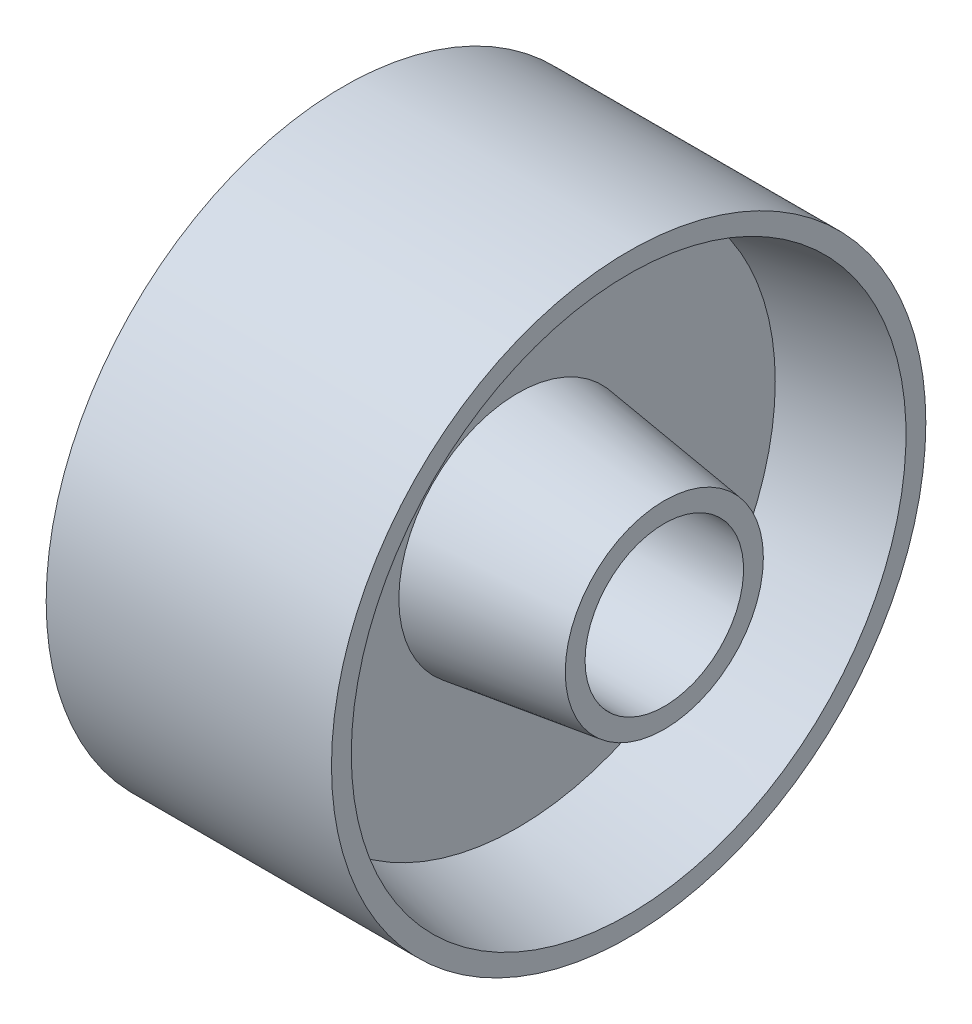
ISO-10303-21;
HEADER;
FILE_DESCRIPTION(('STEP AP214'),'2;1');
FILE_NAME('part.step','',(''),(''),'','','');
FILE_SCHEMA(('AUTOMOTIVE_DESIGN { 1 0 10303 214 1 1 1 1 }'));
ENDSEC;
DATA;
#1=APPLICATION_CONTEXT('core data for automotive mechanical design processes');
#2=APPLICATION_PROTOCOL_DEFINITION('international standard','automotive_design',2000,#1);
#3=PRODUCT_CONTEXT('',#1,'mechanical');
#4=PRODUCT('Part','Part','',(#3));
#5=PRODUCT_RELATED_PRODUCT_CATEGORY('part','',(#4));
#6=PRODUCT_DEFINITION_FORMATION('','',#4);
#7=PRODUCT_DEFINITION_CONTEXT('part definition',#1,'design');
#8=PRODUCT_DEFINITION('design','',#6,#7);
#9=PRODUCT_DEFINITION_SHAPE('','',#8);
#10=(LENGTH_UNIT() NAMED_UNIT(*) SI_UNIT(.MILLI.,.METRE.));
#11=(NAMED_UNIT(*) PLANE_ANGLE_UNIT() SI_UNIT($,.RADIAN.));
#12=(NAMED_UNIT(*) SI_UNIT($,.STERADIAN.) SOLID_ANGLE_UNIT());
#13=UNCERTAINTY_MEASURE_WITH_UNIT(LENGTH_MEASURE(1.E-05),#10,'distance_accuracy_value','');
#14=(GEOMETRIC_REPRESENTATION_CONTEXT(3) GLOBAL_UNCERTAINTY_ASSIGNED_CONTEXT((#13)) GLOBAL_UNIT_ASSIGNED_CONTEXT((#10,
#11,#12)) REPRESENTATION_CONTEXT('',''));
#15=CARTESIAN_POINT('',(0.,0.,0.));
#16=DIRECTION('',(0.,0.,1.));
#17=DIRECTION('',(1.,0.,0.));
#18=AXIS2_PLACEMENT_3D('',#15,#16,#17);
#19=CARTESIAN_POINT('',(36.,75.,0.));
#20=DIRECTION('',(-1.,0.,0.));
#21=DIRECTION('',(0.,0.,1.));
#22=AXIS2_PLACEMENT_3D('',#19,#20,#21);
#23=PLANE('',#22);
#24=CARTESIAN_POINT('',(36.,0.,0.));
#25=DIRECTION('',(-1.,0.,0.));
#26=DIRECTION('',(0.,0.,1.));
#27=AXIS2_PLACEMENT_3D('',#24,#25,#26);
#28=CIRCLE('',#27,75.);
#29=CARTESIAN_POINT('',(36.,0.,75.));
#30=VERTEX_POINT('',#29);
#31=EDGE_CURVE('E79',#30,#30,#28,.T.);
#32=ORIENTED_EDGE('',*,*,#31,.F.);
#33=EDGE_LOOP('',(#32));
#34=FACE_BOUND('',#33,.T.);
#35=CARTESIAN_POINT('',(36.,0.,0.));
#36=DIRECTION('',(-1.,0.,0.));
#37=DIRECTION('',(0.,0.,1.));
#38=AXIS2_PLACEMENT_3D('',#35,#36,#37);
#39=CIRCLE('',#38,70.);
#40=CARTESIAN_POINT('',(36.,0.,70.));
#41=VERTEX_POINT('',#40);
#42=EDGE_CURVE('E10',#41,#41,#39,.T.);
#43=ORIENTED_EDGE('',*,*,#42,.T.);
#44=EDGE_LOOP('',(#43));
#45=FACE_BOUND('',#44,.T.);
#46=ADVANCED_FACE('F39',(#34,#45),#23,.F.);
#47=CARTESIAN_POINT('',(8.,0.,0.));
#48=DIRECTION('',(1.,0.,0.));
#49=DIRECTION('',(0.,0.,-1.));
#50=AXIS2_PLACEMENT_3D('',#47,#48,#49);
#51=CONICAL_SURFACE('',#50,65.,0.176708856070037);
#52=ORIENTED_EDGE('',*,*,#42,.F.);
#53=EDGE_LOOP('',(#52));
#54=FACE_BOUND('',#53,.T.);
#55=CARTESIAN_POINT('',(8.,0.,0.));
#56=DIRECTION('',(-1.,0.,0.));
#57=DIRECTION('',(0.,0.,1.));
#58=AXIS2_PLACEMENT_3D('',#55,#56,#57);
#59=CIRCLE('',#58,65.);
#60=CARTESIAN_POINT('',(8.,0.,65.));
#61=VERTEX_POINT('',#60);
#62=EDGE_CURVE('E45',#61,#61,#59,.T.);
#63=ORIENTED_EDGE('',*,*,#62,.T.);
#64=EDGE_LOOP('',(#63));
#65=FACE_BOUND('',#64,.T.);
#66=ADVANCED_FACE('F86',(#54,#65),#51,.F.);
#67=CARTESIAN_POINT('',(8.,65.,0.));
#68=DIRECTION('',(-1.,0.,0.));
#69=DIRECTION('',(0.,0.,1.));
#70=AXIS2_PLACEMENT_3D('',#67,#68,#69);
#71=PLANE('',#70);
#72=ORIENTED_EDGE('',*,*,#62,.F.);
#73=EDGE_LOOP('',(#72));
#74=FACE_BOUND('',#73,.T.);
#75=CARTESIAN_POINT('',(8.,0.,0.));
#76=DIRECTION('',(-1.,0.,0.));
#77=DIRECTION('',(0.,0.,1.));
#78=AXIS2_PLACEMENT_3D('',#75,#76,#77);
#79=CIRCLE('',#78,30.);
#80=CARTESIAN_POINT('',(8.,0.,30.));
#81=VERTEX_POINT('',#80);
#82=EDGE_CURVE('E49',#81,#81,#79,.T.);
#83=ORIENTED_EDGE('',*,*,#82,.T.);
#84=EDGE_LOOP('',(#83));
#85=FACE_BOUND('',#84,.T.);
#86=ADVANCED_FACE('F90',(#74,#85),#71,.F.);
#87=CARTESIAN_POINT('',(45.,0.,0.));
#88=DIRECTION('',(-1.,0.,0.));
#89=DIRECTION('',(0.,0.,1.));
#90=AXIS2_PLACEMENT_3D('',#87,#88,#89);
#91=CONICAL_SURFACE('',#90,25.,0.134321441952968);
#92=ORIENTED_EDGE('',*,*,#82,.F.);
#93=EDGE_LOOP('',(#92));
#94=FACE_BOUND('',#93,.T.);
#95=CARTESIAN_POINT('',(45.,0.,0.));
#96=DIRECTION('',(-1.,0.,0.));
#97=DIRECTION('',(0.,0.,1.));
#98=AXIS2_PLACEMENT_3D('',#95,#96,#97);
#99=CIRCLE('',#98,25.);
#100=CARTESIAN_POINT('',(45.,0.,25.));
#101=VERTEX_POINT('',#100);
#102=EDGE_CURVE('E53',#101,#101,#99,.T.);
#103=ORIENTED_EDGE('',*,*,#102,.T.);
#104=EDGE_LOOP('',(#103));
#105=FACE_BOUND('',#104,.T.);
#106=ADVANCED_FACE('F95',(#94,#105),#91,.T.);
#107=CARTESIAN_POINT('',(45.,25.,0.));
#108=DIRECTION('',(-1.,0.,0.));
#109=DIRECTION('',(0.,0.,1.));
#110=AXIS2_PLACEMENT_3D('',#107,#108,#109);
#111=PLANE('',#110);
#112=ORIENTED_EDGE('',*,*,#102,.F.);
#113=EDGE_LOOP('',(#112));
#114=FACE_BOUND('',#113,.T.);
#115=CARTESIAN_POINT('',(45.,0.,0.));
#116=DIRECTION('',(-1.,0.,0.));
#117=DIRECTION('',(0.,0.,1.));
#118=AXIS2_PLACEMENT_3D('',#115,#116,#117);
#119=CIRCLE('',#118,20.);
#120=CARTESIAN_POINT('',(45.,0.,20.));
#121=VERTEX_POINT('',#120);
#122=EDGE_CURVE('E58',#121,#121,#119,.T.);
#123=ORIENTED_EDGE('',*,*,#122,.T.);
#124=EDGE_LOOP('',(#123));
#125=FACE_BOUND('',#124,.T.);
#126=ADVANCED_FACE('F101',(#114,#125),#111,.F.);
#127=CARTESIAN_POINT('',(0.,0.,0.));
#128=DIRECTION('',(-1.,0.,0.));
#129=DIRECTION('',(0.,0.,1.));
#130=AXIS2_PLACEMENT_3D('',#127,#128,#129);
#131=CYLINDRICAL_SURFACE('',#130,20.);
#132=ORIENTED_EDGE('',*,*,#122,.F.);
#133=EDGE_LOOP('',(#132));
#134=FACE_BOUND('',#133,.T.);
#135=CARTESIAN_POINT('',(-45.,0.,0.));
#136=DIRECTION('',(-1.,0.,0.));
#137=DIRECTION('',(0.,0.,1.));
#138=AXIS2_PLACEMENT_3D('',#135,#136,#137);
#139=CIRCLE('',#138,20.);
#140=CARTESIAN_POINT('',(-45.,0.,20.));
#141=VERTEX_POINT('',#140);
#142=EDGE_CURVE('E61',#141,#141,#139,.T.);
#143=ORIENTED_EDGE('',*,*,#142,.T.);
#144=EDGE_LOOP('',(#143));
#145=FACE_BOUND('',#144,.T.);
#146=ADVANCED_FACE('F105',(#134,#145),#131,.F.);
#147=CARTESIAN_POINT('',(-45.,25.,0.));
#148=DIRECTION('',(1.,0.,0.));
#149=DIRECTION('',(0.,0.,-1.));
#150=AXIS2_PLACEMENT_3D('',#147,#148,#149);
#151=PLANE('',#150);
#152=ORIENTED_EDGE('',*,*,#142,.F.);
#153=EDGE_LOOP('',(#152));
#154=FACE_BOUND('',#153,.T.);
#155=CARTESIAN_POINT('',(-45.,0.,0.));
#156=DIRECTION('',(-1.,0.,0.));
#157=DIRECTION('',(0.,0.,1.));
#158=AXIS2_PLACEMENT_3D('',#155,#156,#157);
#159=CIRCLE('',#158,25.);
#160=CARTESIAN_POINT('',(-45.,0.,25.));
#161=VERTEX_POINT('',#160);
#162=EDGE_CURVE('E64',#161,#161,#159,.T.);
#163=ORIENTED_EDGE('',*,*,#162,.T.);
#164=EDGE_LOOP('',(#163));
#165=FACE_BOUND('',#164,.T.);
#166=ADVANCED_FACE('F109',(#154,#165),#151,.F.);
#167=CARTESIAN_POINT('',(-8.,0.,0.));
#168=DIRECTION('',(1.,0.,0.));
#169=DIRECTION('',(0.,0.,-1.));
#170=AXIS2_PLACEMENT_3D('',#167,#168,#169);
#171=CONICAL_SURFACE('',#170,30.,0.134321441952968);
#172=ORIENTED_EDGE('',*,*,#162,.F.);
#173=EDGE_LOOP('',(#172));
#174=FACE_BOUND('',#173,.T.);
#175=CARTESIAN_POINT('',(-8.,0.,0.));
#176=DIRECTION('',(-1.,0.,0.));
#177=DIRECTION('',(0.,0.,1.));
#178=AXIS2_PLACEMENT_3D('',#175,#176,#177);
#179=CIRCLE('',#178,30.);
#180=CARTESIAN_POINT('',(-8.,0.,30.));
#181=VERTEX_POINT('',#180);
#182=EDGE_CURVE('E67',#181,#181,#179,.T.);
#183=ORIENTED_EDGE('',*,*,#182,.T.);
#184=EDGE_LOOP('',(#183));
#185=FACE_BOUND('',#184,.T.);
#186=ADVANCED_FACE('F113',(#174,#185),#171,.T.);
#187=CARTESIAN_POINT('',(-8.,65.,0.));
#188=DIRECTION('',(1.,0.,0.));
#189=DIRECTION('',(0.,0.,-1.));
#190=AXIS2_PLACEMENT_3D('',#187,#188,#189);
#191=PLANE('',#190);
#192=ORIENTED_EDGE('',*,*,#182,.F.);
#193=EDGE_LOOP('',(#192));
#194=FACE_BOUND('',#193,.T.);
#195=CARTESIAN_POINT('',(-8.,0.,0.));
#196=DIRECTION('',(-1.,0.,0.));
#197=DIRECTION('',(0.,0.,1.));
#198=AXIS2_PLACEMENT_3D('',#195,#196,#197);
#199=CIRCLE('',#198,65.);
#200=CARTESIAN_POINT('',(-8.,0.,65.));
#201=VERTEX_POINT('',#200);
#202=EDGE_CURVE('E70',#201,#201,#199,.T.);
#203=ORIENTED_EDGE('',*,*,#202,.T.);
#204=EDGE_LOOP('',(#203));
#205=FACE_BOUND('',#204,.T.);
#206=ADVANCED_FACE('F117',(#194,#205),#191,.F.);
#207=CARTESIAN_POINT('',(-36.,0.,0.));
#208=DIRECTION('',(-1.,0.,0.));
#209=DIRECTION('',(0.,0.,1.));
#210=AXIS2_PLACEMENT_3D('',#207,#208,#209);
#211=CONICAL_SURFACE('',#210,70.,0.176708856070037);
#212=ORIENTED_EDGE('',*,*,#202,.F.);
#213=EDGE_LOOP('',(#212));
#214=FACE_BOUND('',#213,.T.);
#215=CARTESIAN_POINT('',(-36.,0.,0.));
#216=DIRECTION('',(-1.,0.,0.));
#217=DIRECTION('',(0.,0.,1.));
#218=AXIS2_PLACEMENT_3D('',#215,#216,#217);
#219=CIRCLE('',#218,70.);
#220=CARTESIAN_POINT('',(-36.,0.,70.));
#221=VERTEX_POINT('',#220);
#222=EDGE_CURVE('E73',#221,#221,#219,.T.);
#223=ORIENTED_EDGE('',*,*,#222,.T.);
#224=EDGE_LOOP('',(#223));
#225=FACE_BOUND('',#224,.T.);
#226=ADVANCED_FACE('F121',(#214,#225),#211,.F.);
#227=CARTESIAN_POINT('',(-36.,75.,0.));
#228=DIRECTION('',(1.,0.,0.));
#229=DIRECTION('',(0.,0.,-1.));
#230=AXIS2_PLACEMENT_3D('',#227,#228,#229);
#231=PLANE('',#230);
#232=ORIENTED_EDGE('',*,*,#222,.F.);
#233=EDGE_LOOP('',(#232));
#234=FACE_BOUND('',#233,.T.);
#235=CARTESIAN_POINT('',(-36.,0.,0.));
#236=DIRECTION('',(-1.,0.,0.));
#237=DIRECTION('',(0.,0.,1.));
#238=AXIS2_PLACEMENT_3D('',#235,#236,#237);
#239=CIRCLE('',#238,75.);
#240=CARTESIAN_POINT('',(-36.,0.,75.));
#241=VERTEX_POINT('',#240);
#242=EDGE_CURVE('E76',#241,#241,#239,.T.);
#243=ORIENTED_EDGE('',*,*,#242,.T.);
#244=EDGE_LOOP('',(#243));
#245=FACE_BOUND('',#244,.T.);
#246=ADVANCED_FACE('F125',(#234,#245),#231,.F.);
#247=CARTESIAN_POINT('',(0.,0.,0.));
#248=DIRECTION('',(-1.,0.,0.));
#249=DIRECTION('',(0.,0.,1.));
#250=AXIS2_PLACEMENT_3D('',#247,#248,#249);
#251=CYLINDRICAL_SURFACE('',#250,75.);
#252=ORIENTED_EDGE('',*,*,#242,.F.);
#253=EDGE_LOOP('',(#252));
#254=FACE_BOUND('',#253,.T.);
#255=ORIENTED_EDGE('',*,*,#31,.T.);
#256=EDGE_LOOP('',(#255));
#257=FACE_BOUND('',#256,.T.);
#258=ADVANCED_FACE('F83',(#254,#257),#251,.T.);
#259=CLOSED_SHELL('',(#46,#66,#86,#106,#126,#146,#166,#186,#206,#226,#246,#258));
#260=MANIFOLD_SOLID_BREP('B2',#259);
#261=ADVANCED_BREP_SHAPE_REPRESENTATION('',(#18,#260),#14);
#262=SHAPE_DEFINITION_REPRESENTATION(#9,#261);
ENDSEC;
END-ISO-10303-21;
